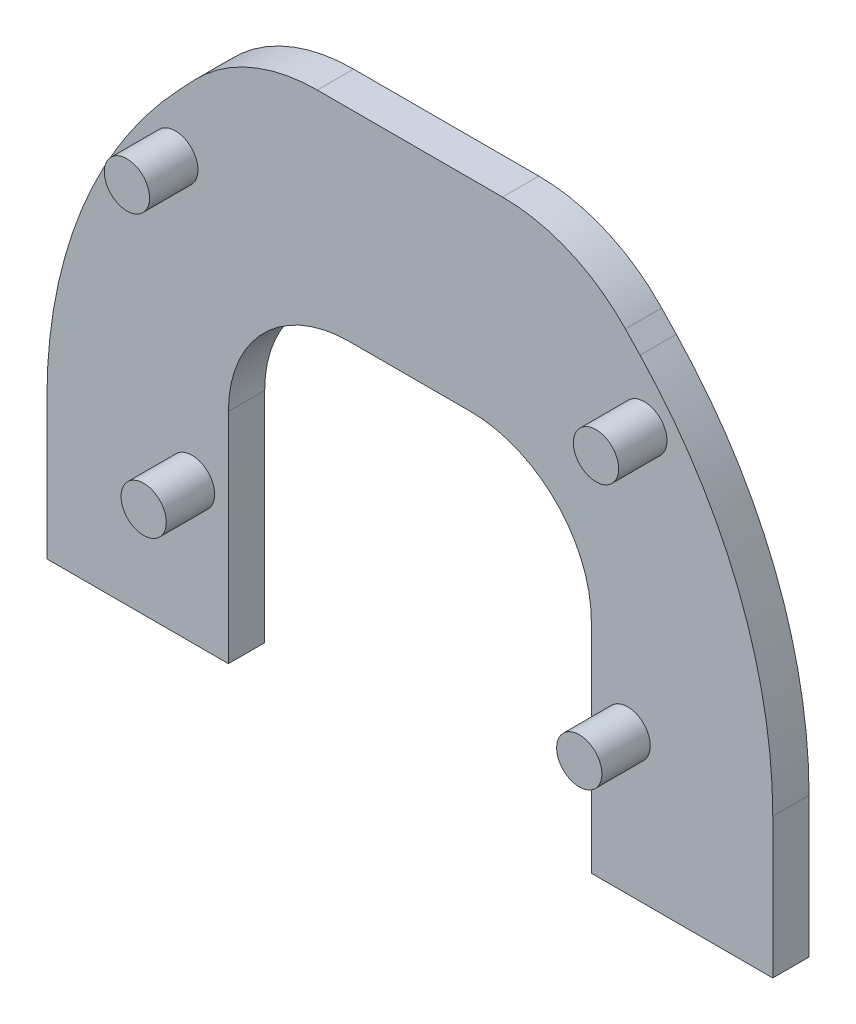
ISO-10303-21;
HEADER;
FILE_DESCRIPTION(('STEP AP214'),'2;1');
FILE_NAME('part.step','',(''),(''),'','','');
FILE_SCHEMA(('AUTOMOTIVE_DESIGN { 1 0 10303 214 1 1 1 1 }'));
ENDSEC;
DATA;
#1=APPLICATION_CONTEXT('core data for automotive mechanical design processes');
#2=APPLICATION_PROTOCOL_DEFINITION('international standard','automotive_design',2000,#1);
#3=PRODUCT_CONTEXT('',#1,'mechanical');
#4=PRODUCT('Part','Part','',(#3));
#5=PRODUCT_RELATED_PRODUCT_CATEGORY('part','',(#4));
#6=PRODUCT_DEFINITION_FORMATION('','',#4);
#7=PRODUCT_DEFINITION_CONTEXT('part definition',#1,'design');
#8=PRODUCT_DEFINITION('design','',#6,#7);
#9=PRODUCT_DEFINITION_SHAPE('','',#8);
#10=(LENGTH_UNIT() NAMED_UNIT(*) SI_UNIT(.MILLI.,.METRE.));
#11=(NAMED_UNIT(*) PLANE_ANGLE_UNIT() SI_UNIT($,.RADIAN.));
#12=(NAMED_UNIT(*) SI_UNIT($,.STERADIAN.) SOLID_ANGLE_UNIT());
#13=UNCERTAINTY_MEASURE_WITH_UNIT(LENGTH_MEASURE(1.E-05),#10,'distance_accuracy_value','');
#14=(GEOMETRIC_REPRESENTATION_CONTEXT(3) GLOBAL_UNCERTAINTY_ASSIGNED_CONTEXT((#13)) GLOBAL_UNIT_ASSIGNED_CONTEXT((#10,
#11,#12)) REPRESENTATION_CONTEXT('',''));
#15=CARTESIAN_POINT('',(0.,0.,0.));
#16=DIRECTION('',(0.,0.,1.));
#17=DIRECTION('',(1.,0.,0.));
#18=AXIS2_PLACEMENT_3D('',#15,#16,#17);
#19=CARTESIAN_POINT('',(-9.72558078659142,71.9793209120225,3.81));
#20=DIRECTION('',(0.,1.,0.));
#21=DIRECTION('',(0.,0.,1.));
#22=AXIS2_PLACEMENT_3D('',#19,#20,#21);
#23=PLANE('',#22);
#24=DIRECTION('',(1.,0.,0.));
#25=VECTOR('',#24,1.);
#26=CARTESIAN_POINT('',(-9.72558078659142,71.9793209120225,0.));
#27=LINE('',#26,#25);
#28=CARTESIAN_POINT('',(-9.72558078659142,71.9793209120225,0.));
#29=VERTEX_POINT('',#28);
#30=CARTESIAN_POINT('',(9.72558073248578,71.9793209120225,0.));
#31=VERTEX_POINT('',#30);
#32=EDGE_CURVE('E181',#29,#31,#27,.T.);
#33=ORIENTED_EDGE('',*,*,#32,.F.);
#34=DIRECTION('',(0.,0.,-1.));
#35=VECTOR('',#34,1.);
#36=CARTESIAN_POINT('',(-9.72558078659142,71.9793209120225,3.81));
#37=LINE('',#36,#35);
#38=CARTESIAN_POINT('',(-9.72558078659142,71.9793209120225,3.81));
#39=VERTEX_POINT('',#38);
#40=EDGE_CURVE('E51',#39,#29,#37,.T.);
#41=ORIENTED_EDGE('',*,*,#40,.F.);
#42=DIRECTION('',(1.,0.,0.));
#43=VECTOR('',#42,1.);
#44=CARTESIAN_POINT('',(-9.72558078659142,71.9793209120225,3.81));
#45=LINE('',#44,#43);
#46=CARTESIAN_POINT('',(9.72558073248578,71.9793209120225,3.81));
#47=VERTEX_POINT('',#46);
#48=EDGE_CURVE('E218',#39,#47,#45,.T.);
#49=ORIENTED_EDGE('',*,*,#48,.T.);
#50=DIRECTION('',(0.,0.,-1.));
#51=VECTOR('',#50,1.);
#52=CARTESIAN_POINT('',(9.72558073248578,71.9793209120225,3.81));
#53=LINE('',#52,#51);
#54=EDGE_CURVE('E36',#47,#31,#53,.T.);
#55=ORIENTED_EDGE('',*,*,#54,.T.);
#56=EDGE_LOOP('',(#33,#41,#49,#55));
#57=FACE_BOUND('',#56,.T.);
#58=ADVANCED_FACE('F33',(#57),#23,.T.);
#59=CARTESIAN_POINT('',(-9.72558078659142,54.1993209120225,3.81));
#60=DIRECTION('',(0.,0.,-1.));
#61=DIRECTION('',(-1.,0.,0.));
#62=AXIS2_PLACEMENT_3D('',#59,#60,#61);
#63=CYLINDRICAL_SURFACE('',#62,17.78);
#64=CARTESIAN_POINT('',(-9.72558078659142,54.1993209120225,0.));
#65=DIRECTION('',(0.,0.,1.));
#66=DIRECTION('',(1.,0.,0.));
#67=AXIS2_PLACEMENT_3D('',#64,#65,#66);
#68=CIRCLE('',#67,17.78);
#69=CARTESIAN_POINT('',(-22.6285472686429,66.4321397189475,0.));
#70=VERTEX_POINT('',#69);
#71=EDGE_CURVE('E104',#29,#70,#68,.T.);
#72=ORIENTED_EDGE('',*,*,#71,.T.);
#73=DIRECTION('',(0.,0.,-1.));
#74=VECTOR('',#73,1.);
#75=CARTESIAN_POINT('',(-22.6285472686429,66.4321397189475,3.81));
#76=LINE('',#75,#74);
#77=CARTESIAN_POINT('',(-22.6285472686429,66.4321397189475,3.81));
#78=VERTEX_POINT('',#77);
#79=EDGE_CURVE('E168',#78,#70,#76,.T.);
#80=ORIENTED_EDGE('',*,*,#79,.F.);
#81=CARTESIAN_POINT('',(-9.72558078659142,54.1993209120225,3.81));
#82=DIRECTION('',(0.,0.,1.));
#83=DIRECTION('',(1.,0.,0.));
#84=AXIS2_PLACEMENT_3D('',#81,#82,#83);
#85=CIRCLE('',#84,17.78);
#86=EDGE_CURVE('E158',#39,#78,#85,.T.);
#87=ORIENTED_EDGE('',*,*,#86,.F.);
#88=ORIENTED_EDGE('',*,*,#40,.T.);
#89=EDGE_LOOP('',(#72,#80,#87,#88));
#90=FACE_BOUND('',#89,.T.);
#91=ADVANCED_FACE('F326',(#90),#63,.T.);
#92=CARTESIAN_POINT('',(-22.6285472686429,66.4321397189475,3.81));
#93=DIRECTION('',(0.7257011519714,-0.688010056632447,0.));
#94=DIRECTION('',(0.688010056632447,0.7257011519714,0.));
#95=AXIS2_PLACEMENT_3D('',#92,#93,#94);
#96=PLANE('',#95);
#97=DIRECTION('',(-0.688010056632447,-0.7257011519714,0.));
#98=VECTOR('',#97,1.);
#99=CARTESIAN_POINT('',(-22.6285472686429,66.4321397189475,0.));
#100=LINE('',#99,#98);
#101=CARTESIAN_POINT('',(-24.165618520147,64.8108634496173,0.));
#102=VERTEX_POINT('',#101);
#103=EDGE_CURVE('E165',#70,#102,#100,.T.);
#104=ORIENTED_EDGE('',*,*,#103,.T.);
#105=DIRECTION('',(0.,0.,-1.));
#106=VECTOR('',#105,1.);
#107=CARTESIAN_POINT('',(-24.165618520147,64.8108634496173,3.81));
#108=LINE('',#107,#106);
#109=CARTESIAN_POINT('',(-24.165618520147,64.8108634496173,3.81));
#110=VERTEX_POINT('',#109);
#111=EDGE_CURVE('E162',#110,#102,#108,.T.);
#112=ORIENTED_EDGE('',*,*,#111,.F.);
#113=DIRECTION('',(-0.688010056632447,-0.7257011519714,0.));
#114=VECTOR('',#113,1.);
#115=CARTESIAN_POINT('',(-22.6285472686429,66.4321397189475,3.81));
#116=LINE('',#115,#114);
#117=EDGE_CURVE('E152',#78,#110,#116,.T.);
#118=ORIENTED_EDGE('',*,*,#117,.F.);
#119=ORIENTED_EDGE('',*,*,#79,.T.);
#120=EDGE_LOOP('',(#104,#112,#118,#119));
#121=FACE_BOUND('',#120,.T.);
#122=ADVANCED_FACE('F163',(#121),#96,.F.);
#123=CARTESIAN_POINT('',(12.7,29.8599525726889,3.81));
#124=DIRECTION('',(0.,0.,-1.));
#125=DIRECTION('',(-1.,0.,0.));
#126=AXIS2_PLACEMENT_3D('',#123,#124,#125);
#127=CYLINDRICAL_SURFACE('',#126,50.8);
#128=CARTESIAN_POINT('',(12.7,29.8599525726889,0.));
#129=DIRECTION('',(0.,0.,1.));
#130=DIRECTION('',(1.,0.,0.));
#131=AXIS2_PLACEMENT_3D('',#128,#129,#130);
#132=CIRCLE('',#131,50.8);
#133=CARTESIAN_POINT('',(-38.1,29.8599525726889,0.));
#134=VERTEX_POINT('',#133);
#135=EDGE_CURVE('E214',#102,#134,#132,.T.);
#136=ORIENTED_EDGE('',*,*,#135,.T.);
#137=DIRECTION('',(0.,0.,-1.));
#138=VECTOR('',#137,1.);
#139=CARTESIAN_POINT('',(-38.1,29.8599525726889,3.81));
#140=LINE('',#139,#138);
#141=CARTESIAN_POINT('',(-38.1,29.8599525726889,3.81));
#142=VERTEX_POINT('',#141);
#143=EDGE_CURVE('E169',#142,#134,#140,.T.);
#144=ORIENTED_EDGE('',*,*,#143,.F.);
#145=CARTESIAN_POINT('',(12.7,29.8599525726889,3.81));
#146=DIRECTION('',(0.,0.,1.));
#147=DIRECTION('',(1.,0.,0.));
#148=AXIS2_PLACEMENT_3D('',#145,#146,#147);
#149=CIRCLE('',#148,50.8);
#150=EDGE_CURVE('E156',#110,#142,#149,.T.);
#151=ORIENTED_EDGE('',*,*,#150,.F.);
#152=ORIENTED_EDGE('',*,*,#111,.T.);
#153=EDGE_LOOP('',(#136,#144,#151,#152));
#154=FACE_BOUND('',#153,.T.);
#155=ADVANCED_FACE('F171',(#154),#127,.T.);
#156=CARTESIAN_POINT('',(-38.1,29.8599525726889,3.81));
#157=DIRECTION('',(1.,0.,0.));
#158=DIRECTION('',(0.,0.,-1.));
#159=AXIS2_PLACEMENT_3D('',#156,#157,#158);
#160=PLANE('',#159);
#161=DIRECTION('',(0.,-1.,0.));
#162=VECTOR('',#161,1.);
#163=CARTESIAN_POINT('',(-38.1,29.8599525726889,0.));
#164=LINE('',#163,#162);
#165=CARTESIAN_POINT('',(-38.1,15.1587400793602,0.));
#166=VERTEX_POINT('',#165);
#167=EDGE_CURVE('E212',#134,#166,#164,.T.);
#168=ORIENTED_EDGE('',*,*,#167,.T.);
#169=DIRECTION('',(0.,0.,-1.));
#170=VECTOR('',#169,1.);
#171=CARTESIAN_POINT('',(-38.1,15.1587400793602,3.81));
#172=LINE('',#171,#170);
#173=CARTESIAN_POINT('',(-38.1,15.1587400793602,3.81));
#174=VERTEX_POINT('',#173);
#175=EDGE_CURVE('E222',#174,#166,#172,.T.);
#176=ORIENTED_EDGE('',*,*,#175,.F.);
#177=DIRECTION('',(0.,-1.,0.));
#178=VECTOR('',#177,1.);
#179=CARTESIAN_POINT('',(-38.1,29.8599525726889,3.81));
#180=LINE('',#179,#178);
#181=EDGE_CURVE('E174',#142,#174,#180,.T.);
#182=ORIENTED_EDGE('',*,*,#181,.F.);
#183=ORIENTED_EDGE('',*,*,#143,.T.);
#184=EDGE_LOOP('',(#168,#176,#182,#183));
#185=FACE_BOUND('',#184,.T.);
#186=ADVANCED_FACE('F259',(#185),#160,.F.);
#187=CARTESIAN_POINT('',(-38.1,15.1587400793602,3.81));
#188=DIRECTION('',(0.,1.,0.));
#189=DIRECTION('',(-1.,0.,0.));
#190=AXIS2_PLACEMENT_3D('',#187,#188,#189);
#191=PLANE('',#190);
#192=DIRECTION('',(1.,0.,0.));
#193=VECTOR('',#192,1.);
#194=CARTESIAN_POINT('',(-38.1,15.1587400793602,0.));
#195=LINE('',#194,#193);
#196=CARTESIAN_POINT('',(-19.05,15.1587400793602,0.));
#197=VERTEX_POINT('',#196);
#198=EDGE_CURVE('E210',#166,#197,#195,.T.);
#199=ORIENTED_EDGE('',*,*,#198,.T.);
#200=DIRECTION('',(0.,0.,-1.));
#201=VECTOR('',#200,1.);
#202=CARTESIAN_POINT('',(-19.05,15.1587400793602,3.81));
#203=LINE('',#202,#201);
#204=CARTESIAN_POINT('',(-19.05,15.1587400793602,3.81));
#205=VERTEX_POINT('',#204);
#206=EDGE_CURVE('E225',#205,#197,#203,.T.);
#207=ORIENTED_EDGE('',*,*,#206,.F.);
#208=DIRECTION('',(1.,0.,0.));
#209=VECTOR('',#208,1.);
#210=CARTESIAN_POINT('',(-38.1,15.1587400793602,3.81));
#211=LINE('',#210,#209);
#212=EDGE_CURVE('E176',#174,#205,#211,.T.);
#213=ORIENTED_EDGE('',*,*,#212,.F.);
#214=ORIENTED_EDGE('',*,*,#175,.T.);
#215=EDGE_LOOP('',(#199,#207,#213,#214));
#216=FACE_BOUND('',#215,.T.);
#217=ADVANCED_FACE('F268',(#216),#191,.F.);
#218=CARTESIAN_POINT('',(-19.05,15.1587400793602,3.81));
#219=DIRECTION('',(-1.,0.,0.));
#220=DIRECTION('',(0.,-1.,0.));
#221=AXIS2_PLACEMENT_3D('',#218,#219,#220);
#222=PLANE('',#221);
#223=DIRECTION('',(0.,1.,0.));
#224=VECTOR('',#223,1.);
#225=CARTESIAN_POINT('',(-19.05,15.1587400793602,0.));
#226=LINE('',#225,#224);
#227=CARTESIAN_POINT('',(-19.05,38.1,0.));
#228=VERTEX_POINT('',#227);
#229=EDGE_CURVE('E207',#197,#228,#226,.T.);
#230=ORIENTED_EDGE('',*,*,#229,.T.);
#231=DIRECTION('',(0.,0.,-1.));
#232=VECTOR('',#231,1.);
#233=CARTESIAN_POINT('',(-19.05,38.1,3.81));
#234=LINE('',#233,#232);
#235=CARTESIAN_POINT('',(-19.05,38.1,3.81));
#236=VERTEX_POINT('',#235);
#237=EDGE_CURVE('E228',#236,#228,#234,.T.);
#238=ORIENTED_EDGE('',*,*,#237,.F.);
#239=DIRECTION('',(0.,1.,0.));
#240=VECTOR('',#239,1.);
#241=CARTESIAN_POINT('',(-19.05,15.1587400793602,3.81));
#242=LINE('',#241,#240);
#243=EDGE_CURVE('E265',#205,#236,#242,.T.);
#244=ORIENTED_EDGE('',*,*,#243,.F.);
#245=ORIENTED_EDGE('',*,*,#206,.T.);
#246=EDGE_LOOP('',(#230,#238,#244,#245));
#247=FACE_BOUND('',#246,.T.);
#248=ADVANCED_FACE('F271',(#247),#222,.F.);
#249=CARTESIAN_POINT('',(-6.35,38.1,3.81));
#250=DIRECTION('',(0.,0.,-1.));
#251=DIRECTION('',(-1.,0.,0.));
#252=AXIS2_PLACEMENT_3D('',#249,#250,#251);
#253=CYLINDRICAL_SURFACE('',#252,12.7);
#254=CARTESIAN_POINT('',(-6.35,38.1,0.));
#255=DIRECTION('',(0.,0.,1.));
#256=DIRECTION('',(1.,0.,0.));
#257=AXIS2_PLACEMENT_3D('',#254,#255,#256);
#258=CIRCLE('',#257,12.7);
#259=CARTESIAN_POINT('',(-6.35,50.8,0.));
#260=VERTEX_POINT('',#259);
#261=EDGE_CURVE('E204',#260,#228,#258,.T.);
#262=ORIENTED_EDGE('',*,*,#261,.F.);
#263=DIRECTION('',(0.,0.,-1.));
#264=VECTOR('',#263,1.);
#265=CARTESIAN_POINT('',(-6.35,50.8,3.81));
#266=LINE('',#265,#264);
#267=CARTESIAN_POINT('',(-6.35,50.8,3.81));
#268=VERTEX_POINT('',#267);
#269=EDGE_CURVE('E230',#268,#260,#266,.T.);
#270=ORIENTED_EDGE('',*,*,#269,.F.);
#271=CARTESIAN_POINT('',(-6.35,38.1,3.81));
#272=DIRECTION('',(0.,0.,1.));
#273=DIRECTION('',(1.,0.,0.));
#274=AXIS2_PLACEMENT_3D('',#271,#272,#273);
#275=CIRCLE('',#274,12.7);
#276=EDGE_CURVE('E273',#268,#236,#275,.T.);
#277=ORIENTED_EDGE('',*,*,#276,.T.);
#278=ORIENTED_EDGE('',*,*,#237,.T.);
#279=EDGE_LOOP('',(#262,#270,#277,#278));
#280=FACE_BOUND('',#279,.T.);
#281=ADVANCED_FACE('F346',(#280),#253,.F.);
#282=CARTESIAN_POINT('',(-6.35,50.8,3.81));
#283=DIRECTION('',(0.,1.,0.));
#284=DIRECTION('',(0.,0.,1.));
#285=AXIS2_PLACEMENT_3D('',#282,#283,#284);
#286=PLANE('',#285);
#287=DIRECTION('',(1.,0.,0.));
#288=VECTOR('',#287,1.);
#289=CARTESIAN_POINT('',(-6.35,50.8,0.));
#290=LINE('',#289,#288);
#291=CARTESIAN_POINT('',(6.35000000000001,50.8,0.));
#292=VERTEX_POINT('',#291);
#293=EDGE_CURVE('E201',#260,#292,#290,.T.);
#294=ORIENTED_EDGE('',*,*,#293,.T.);
#295=DIRECTION('',(0.,0.,-1.));
#296=VECTOR('',#295,1.);
#297=CARTESIAN_POINT('',(6.35000000000001,50.8,3.81));
#298=LINE('',#297,#296);
#299=CARTESIAN_POINT('',(6.35000000000001,50.8,3.81));
#300=VERTEX_POINT('',#299);
#301=EDGE_CURVE('E232',#300,#292,#298,.T.);
#302=ORIENTED_EDGE('',*,*,#301,.F.);
#303=DIRECTION('',(1.,0.,0.));
#304=VECTOR('',#303,1.);
#305=CARTESIAN_POINT('',(-6.35,50.8,3.81));
#306=LINE('',#305,#304);
#307=EDGE_CURVE('E275',#268,#300,#306,.T.);
#308=ORIENTED_EDGE('',*,*,#307,.F.);
#309=ORIENTED_EDGE('',*,*,#269,.T.);
#310=EDGE_LOOP('',(#294,#302,#308,#309));
#311=FACE_BOUND('',#310,.T.);
#312=ADVANCED_FACE('F349',(#311),#286,.F.);
#313=CARTESIAN_POINT('',(6.35,38.1,3.81));
#314=DIRECTION('',(0.,0.,-1.));
#315=DIRECTION('',(-1.,0.,0.));
#316=AXIS2_PLACEMENT_3D('',#313,#314,#315);
#317=CYLINDRICAL_SURFACE('',#316,12.7);
#318=CARTESIAN_POINT('',(6.35,38.1,0.));
#319=DIRECTION('',(0.,0.,1.));
#320=DIRECTION('',(1.,0.,0.));
#321=AXIS2_PLACEMENT_3D('',#318,#319,#320);
#322=CIRCLE('',#321,12.7);
#323=CARTESIAN_POINT('',(19.05,38.1,0.));
#324=VERTEX_POINT('',#323);
#325=EDGE_CURVE('E198',#324,#292,#322,.T.);
#326=ORIENTED_EDGE('',*,*,#325,.F.);
#327=DIRECTION('',(0.,0.,-1.));
#328=VECTOR('',#327,1.);
#329=CARTESIAN_POINT('',(19.05,38.1,3.81));
#330=LINE('',#329,#328);
#331=CARTESIAN_POINT('',(19.05,38.1,3.81));
#332=VERTEX_POINT('',#331);
#333=EDGE_CURVE('E234',#332,#324,#330,.T.);
#334=ORIENTED_EDGE('',*,*,#333,.F.);
#335=CARTESIAN_POINT('',(6.35,38.1,3.81));
#336=DIRECTION('',(0.,0.,1.));
#337=DIRECTION('',(1.,0.,0.));
#338=AXIS2_PLACEMENT_3D('',#335,#336,#337);
#339=CIRCLE('',#338,12.7);
#340=EDGE_CURVE('E279',#332,#300,#339,.T.);
#341=ORIENTED_EDGE('',*,*,#340,.T.);
#342=ORIENTED_EDGE('',*,*,#301,.T.);
#343=EDGE_LOOP('',(#326,#334,#341,#342));
#344=FACE_BOUND('',#343,.T.);
#345=ADVANCED_FACE('F353',(#344),#317,.F.);
#346=CARTESIAN_POINT('',(19.05,38.1,3.81));
#347=DIRECTION('',(1.,0.,0.));
#348=DIRECTION('',(0.,1.,0.));
#349=AXIS2_PLACEMENT_3D('',#346,#347,#348);
#350=PLANE('',#349);
#351=DIRECTION('',(0.,-1.,0.));
#352=VECTOR('',#351,1.);
#353=CARTESIAN_POINT('',(19.05,38.1,0.));
#354=LINE('',#353,#352);
#355=CARTESIAN_POINT('',(19.05,15.1587400793602,0.));
#356=VERTEX_POINT('',#355);
#357=EDGE_CURVE('E196',#324,#356,#354,.T.);
#358=ORIENTED_EDGE('',*,*,#357,.T.);
#359=DIRECTION('',(0.,0.,-1.));
#360=VECTOR('',#359,1.);
#361=CARTESIAN_POINT('',(19.05,15.1587400793602,3.81));
#362=LINE('',#361,#360);
#363=CARTESIAN_POINT('',(19.05,15.1587400793602,3.81));
#364=VERTEX_POINT('',#363);
#365=EDGE_CURVE('E236',#364,#356,#362,.T.);
#366=ORIENTED_EDGE('',*,*,#365,.F.);
#367=DIRECTION('',(0.,-1.,0.));
#368=VECTOR('',#367,1.);
#369=CARTESIAN_POINT('',(19.05,38.1,3.81));
#370=LINE('',#369,#368);
#371=EDGE_CURVE('E282',#332,#364,#370,.T.);
#372=ORIENTED_EDGE('',*,*,#371,.F.);
#373=ORIENTED_EDGE('',*,*,#333,.T.);
#374=EDGE_LOOP('',(#358,#366,#372,#373));
#375=FACE_BOUND('',#374,.T.);
#376=ADVANCED_FACE('F357',(#375),#350,.F.);
#377=CARTESIAN_POINT('',(19.05,15.1587400793602,3.81));
#378=DIRECTION('',(0.,1.,0.));
#379=DIRECTION('',(-1.,0.,0.));
#380=AXIS2_PLACEMENT_3D('',#377,#378,#379);
#381=PLANE('',#380);
#382=DIRECTION('',(1.,0.,0.));
#383=VECTOR('',#382,1.);
#384=CARTESIAN_POINT('',(19.05,15.1587400793602,0.));
#385=LINE('',#384,#383);
#386=CARTESIAN_POINT('',(38.1,15.1587400793602,0.));
#387=VERTEX_POINT('',#386);
#388=EDGE_CURVE('E194',#356,#387,#385,.T.);
#389=ORIENTED_EDGE('',*,*,#388,.T.);
#390=DIRECTION('',(0.,0.,-1.));
#391=VECTOR('',#390,1.);
#392=CARTESIAN_POINT('',(38.1,15.1587400793602,3.81));
#393=LINE('',#392,#391);
#394=CARTESIAN_POINT('',(38.1,15.1587400793602,3.81));
#395=VERTEX_POINT('',#394);
#396=EDGE_CURVE('E239',#395,#387,#393,.T.);
#397=ORIENTED_EDGE('',*,*,#396,.F.);
#398=DIRECTION('',(1.,0.,0.));
#399=VECTOR('',#398,1.);
#400=CARTESIAN_POINT('',(19.05,15.1587400793602,3.81));
#401=LINE('',#400,#399);
#402=EDGE_CURVE('E284',#364,#395,#401,.T.);
#403=ORIENTED_EDGE('',*,*,#402,.F.);
#404=ORIENTED_EDGE('',*,*,#365,.T.);
#405=EDGE_LOOP('',(#389,#397,#403,#404));
#406=FACE_BOUND('',#405,.T.);
#407=ADVANCED_FACE('F361',(#406),#381,.F.);
#408=CARTESIAN_POINT('',(38.1,15.1587400793602,3.81));
#409=DIRECTION('',(-1.,0.,0.));
#410=DIRECTION('',(0.,0.,1.));
#411=AXIS2_PLACEMENT_3D('',#408,#409,#410);
#412=PLANE('',#411);
#413=DIRECTION('',(0.,1.,0.));
#414=VECTOR('',#413,1.);
#415=CARTESIAN_POINT('',(38.1,15.1587400793602,0.));
#416=LINE('',#415,#414);
#417=CARTESIAN_POINT('',(38.1,29.8599525214859,0.));
#418=VERTEX_POINT('',#417);
#419=EDGE_CURVE('E192',#387,#418,#416,.T.);
#420=ORIENTED_EDGE('',*,*,#419,.T.);
#421=DIRECTION('',(0.,0.,-1.));
#422=VECTOR('',#421,1.);
#423=CARTESIAN_POINT('',(38.1,29.8599525214859,3.81));
#424=LINE('',#423,#422);
#425=CARTESIAN_POINT('',(38.1,29.8599525214859,3.81));
#426=VERTEX_POINT('',#425);
#427=EDGE_CURVE('E242',#426,#418,#424,.T.);
#428=ORIENTED_EDGE('',*,*,#427,.F.);
#429=DIRECTION('',(0.,1.,0.));
#430=VECTOR('',#429,1.);
#431=CARTESIAN_POINT('',(38.1,15.1587400793602,3.81));
#432=LINE('',#431,#430);
#433=EDGE_CURVE('E286',#395,#426,#432,.T.);
#434=ORIENTED_EDGE('',*,*,#433,.F.);
#435=ORIENTED_EDGE('',*,*,#396,.T.);
#436=EDGE_LOOP('',(#420,#428,#434,#435));
#437=FACE_BOUND('',#436,.T.);
#438=ADVANCED_FACE('F365',(#437),#412,.F.);
#439=CARTESIAN_POINT('',(-12.7,29.8599525214859,3.81));
#440=DIRECTION('',(0.,0.,-1.));
#441=DIRECTION('',(-1.,0.,0.));
#442=AXIS2_PLACEMENT_3D('',#439,#440,#441);
#443=CYLINDRICAL_SURFACE('',#442,50.8);
#444=CARTESIAN_POINT('',(-12.7,29.8599525214859,0.));
#445=DIRECTION('',(0.,0.,1.));
#446=DIRECTION('',(1.,0.,0.));
#447=AXIS2_PLACEMENT_3D('',#444,#445,#446);
#448=CIRCLE('',#447,50.8);
#449=CARTESIAN_POINT('',(24.1656184570005,64.8108634650202,0.));
#450=VERTEX_POINT('',#449);
#451=EDGE_CURVE('E190',#418,#450,#448,.T.);
#452=ORIENTED_EDGE('',*,*,#451,.T.);
#453=DIRECTION('',(0.,0.,-1.));
#454=VECTOR('',#453,1.);
#455=CARTESIAN_POINT('',(24.1656184570005,64.8108634650202,3.81));
#456=LINE('',#455,#454);
#457=CARTESIAN_POINT('',(24.1656184570005,64.8108634650202,3.81));
#458=VERTEX_POINT('',#457);
#459=EDGE_CURVE('E245',#458,#450,#456,.T.);
#460=ORIENTED_EDGE('',*,*,#459,.F.);
#461=CARTESIAN_POINT('',(-12.7,29.8599525214859,3.81));
#462=DIRECTION('',(0.,0.,1.));
#463=DIRECTION('',(1.,0.,0.));
#464=AXIS2_PLACEMENT_3D('',#461,#462,#463);
#465=CIRCLE('',#464,50.8);
#466=EDGE_CURVE('E288',#426,#458,#465,.T.);
#467=ORIENTED_EDGE('',*,*,#466,.F.);
#468=ORIENTED_EDGE('',*,*,#427,.T.);
#469=EDGE_LOOP('',(#452,#460,#467,#468));
#470=FACE_BOUND('',#469,.T.);
#471=ADVANCED_FACE('F369',(#470),#443,.T.);
#472=CARTESIAN_POINT('',(24.1656184570005,64.8108634650202,3.81));
#473=DIRECTION('',(-0.725701150728358,-0.688010057943587,0.));
#474=DIRECTION('',(0.688010057943587,-0.725701150728358,0.));
#475=AXIS2_PLACEMENT_3D('',#472,#473,#474);
#476=PLANE('',#475);
#477=DIRECTION('',(-0.688010057943587,0.725701150728358,0.));
#478=VECTOR('',#477,1.);
#479=CARTESIAN_POINT('',(24.1656184570005,64.8108634650202,0.));
#480=LINE('',#479,#478);
#481=CARTESIAN_POINT('',(22.6285471924359,66.4321397422595,0.));
#482=VERTEX_POINT('',#481);
#483=EDGE_CURVE('E188',#450,#482,#480,.T.);
#484=ORIENTED_EDGE('',*,*,#483,.T.);
#485=DIRECTION('',(0.,0.,-1.));
#486=VECTOR('',#485,1.);
#487=CARTESIAN_POINT('',(22.6285471924359,66.4321397422595,3.81));
#488=LINE('',#487,#486);
#489=CARTESIAN_POINT('',(22.6285471924359,66.4321397422595,3.81));
#490=VERTEX_POINT('',#489);
#491=EDGE_CURVE('E247',#490,#482,#488,.T.);
#492=ORIENTED_EDGE('',*,*,#491,.F.);
#493=DIRECTION('',(-0.688010057943587,0.725701150728358,0.));
#494=VECTOR('',#493,1.);
#495=CARTESIAN_POINT('',(24.1656184570005,64.8108634650202,3.81));
#496=LINE('',#495,#494);
#497=EDGE_CURVE('E290',#458,#490,#496,.T.);
#498=ORIENTED_EDGE('',*,*,#497,.F.);
#499=ORIENTED_EDGE('',*,*,#459,.T.);
#500=EDGE_LOOP('',(#484,#492,#498,#499));
#501=FACE_BOUND('',#500,.T.);
#502=ADVANCED_FACE('F373',(#501),#476,.F.);
#503=CARTESIAN_POINT('',(9.72558073248578,54.1993209120225,3.81));
#504=DIRECTION('',(0.,0.,-1.));
#505=DIRECTION('',(-1.,0.,0.));
#506=AXIS2_PLACEMENT_3D('',#503,#504,#505);
#507=CYLINDRICAL_SURFACE('',#506,17.78);
#508=CARTESIAN_POINT('',(9.72558073248578,54.1993209120225,0.));
#509=DIRECTION('',(0.,0.,1.));
#510=DIRECTION('',(1.,0.,0.));
#511=AXIS2_PLACEMENT_3D('',#508,#509,#510);
#512=CIRCLE('',#511,17.78);
#513=EDGE_CURVE('E184',#482,#31,#512,.T.);
#514=ORIENTED_EDGE('',*,*,#513,.T.);
#515=ORIENTED_EDGE('',*,*,#54,.F.);
#516=CARTESIAN_POINT('',(9.72558073248578,54.1993209120225,3.81));
#517=DIRECTION('',(0.,0.,1.));
#518=DIRECTION('',(1.,0.,0.));
#519=AXIS2_PLACEMENT_3D('',#516,#517,#518);
#520=CIRCLE('',#519,17.78);
#521=EDGE_CURVE('E114',#490,#47,#520,.T.);
#522=ORIENTED_EDGE('',*,*,#521,.F.);
#523=ORIENTED_EDGE('',*,*,#491,.T.);
#524=EDGE_LOOP('',(#514,#515,#522,#523));
#525=FACE_BOUND('',#524,.T.);
#526=ADVANCED_FACE('F252',(#525),#507,.T.);
#527=CARTESIAN_POINT('',(9.72558073248578,54.1993209120225,3.81));
#528=DIRECTION('',(0.,0.,1.));
#529=DIRECTION('',(1.,0.,0.));
#530=AXIS2_PLACEMENT_3D('',#527,#528,#529);
#531=PLANE('',#530);
#532=CARTESIAN_POINT('',(22.8654210307654,29.826745674845,3.81));
#533=DIRECTION('',(0.,0.,1.));
#534=DIRECTION('',(1.,0.,0.));
#535=AXIS2_PLACEMENT_3D('',#532,#533,#534);
#536=CIRCLE('',#535,2.3749);
#537=CARTESIAN_POINT('',(25.2403210307654,29.826745674845,3.81));
#538=VERTEX_POINT('',#537);
#539=EDGE_CURVE('E11',#538,#538,#536,.T.);
#540=ORIENTED_EDGE('',*,*,#539,.F.);
#541=EDGE_LOOP('',(#540));
#542=FACE_BOUND('',#541,.T.);
#543=CARTESIAN_POINT('',(24.6225214451482,58.4452861325743,3.81));
#544=DIRECTION('',(0.,0.,1.));
#545=DIRECTION('',(1.,0.,0.));
#546=AXIS2_PLACEMENT_3D('',#543,#544,#545);
#547=CIRCLE('',#546,2.3749);
#548=CARTESIAN_POINT('',(26.9974214451482,58.4452861325743,3.81));
#549=VERTEX_POINT('',#548);
#550=EDGE_CURVE('E42',#549,#549,#547,.T.);
#551=ORIENTED_EDGE('',*,*,#550,.F.);
#552=EDGE_LOOP('',(#551));
#553=FACE_BOUND('',#552,.T.);
#554=CARTESIAN_POINT('',(-22.8654210307654,29.826745674845,3.81));
#555=DIRECTION('',(0.,0.,1.));
#556=DIRECTION('',(1.,0.,0.));
#557=AXIS2_PLACEMENT_3D('',#554,#555,#556);
#558=CIRCLE('',#557,2.3749);
#559=CARTESIAN_POINT('',(-20.4905210307654,29.826745674845,3.81));
#560=VERTEX_POINT('',#559);
#561=EDGE_CURVE('E299',#560,#560,#558,.F.);
#562=ORIENTED_EDGE('',*,*,#561,.T.);
#563=EDGE_LOOP('',(#562));
#564=FACE_BOUND('',#563,.T.);
#565=CARTESIAN_POINT('',(-24.6225214451482,58.4452861325743,3.81));
#566=DIRECTION('',(0.,0.,1.));
#567=DIRECTION('',(1.,0.,0.));
#568=AXIS2_PLACEMENT_3D('',#565,#566,#567);
#569=CIRCLE('',#568,2.3749);
#570=CARTESIAN_POINT('',(-22.2476214451482,58.4452861325743,3.81));
#571=VERTEX_POINT('',#570);
#572=EDGE_CURVE('E185',#571,#571,#569,.F.);
#573=ORIENTED_EDGE('',*,*,#572,.T.);
#574=EDGE_LOOP('',(#573));
#575=FACE_BOUND('',#574,.T.);
#576=ORIENTED_EDGE('',*,*,#48,.F.);
#577=ORIENTED_EDGE('',*,*,#86,.T.);
#578=ORIENTED_EDGE('',*,*,#117,.T.);
#579=ORIENTED_EDGE('',*,*,#150,.T.);
#580=ORIENTED_EDGE('',*,*,#181,.T.);
#581=ORIENTED_EDGE('',*,*,#212,.T.);
#582=ORIENTED_EDGE('',*,*,#243,.T.);
#583=ORIENTED_EDGE('',*,*,#276,.F.);
#584=ORIENTED_EDGE('',*,*,#307,.T.);
#585=ORIENTED_EDGE('',*,*,#340,.F.);
#586=ORIENTED_EDGE('',*,*,#371,.T.);
#587=ORIENTED_EDGE('',*,*,#402,.T.);
#588=ORIENTED_EDGE('',*,*,#433,.T.);
#589=ORIENTED_EDGE('',*,*,#466,.T.);
#590=ORIENTED_EDGE('',*,*,#497,.T.);
#591=ORIENTED_EDGE('',*,*,#521,.T.);
#592=EDGE_LOOP('',(#576,#577,#578,#579,#580,#581,#582,#583,#584,#585,#586,#587,#588,#589,#590,#591));
#593=FACE_BOUND('',#592,.T.);
#594=ADVANCED_FACE('F154',(#542,#553,#564,#575,#593),#531,.T.);
#595=CARTESIAN_POINT('',(9.72558073248578,54.1993209120225,0.));
#596=DIRECTION('',(0.,0.,1.));
#597=DIRECTION('',(1.,0.,0.));
#598=AXIS2_PLACEMENT_3D('',#595,#596,#597);
#599=PLANE('',#598);
#600=ORIENTED_EDGE('',*,*,#32,.T.);
#601=ORIENTED_EDGE('',*,*,#513,.F.);
#602=ORIENTED_EDGE('',*,*,#483,.F.);
#603=ORIENTED_EDGE('',*,*,#451,.F.);
#604=ORIENTED_EDGE('',*,*,#419,.F.);
#605=ORIENTED_EDGE('',*,*,#388,.F.);
#606=ORIENTED_EDGE('',*,*,#357,.F.);
#607=ORIENTED_EDGE('',*,*,#325,.T.);
#608=ORIENTED_EDGE('',*,*,#293,.F.);
#609=ORIENTED_EDGE('',*,*,#261,.T.);
#610=ORIENTED_EDGE('',*,*,#229,.F.);
#611=ORIENTED_EDGE('',*,*,#198,.F.);
#612=ORIENTED_EDGE('',*,*,#167,.F.);
#613=ORIENTED_EDGE('',*,*,#135,.F.);
#614=ORIENTED_EDGE('',*,*,#103,.F.);
#615=ORIENTED_EDGE('',*,*,#71,.F.);
#616=EDGE_LOOP('',(#600,#601,#602,#603,#604,#605,#606,#607,#608,#609,#610,#611,#612,#613,#614,#615));
#617=FACE_BOUND('',#616,.T.);
#618=ADVANCED_FACE('F255',(#617),#599,.F.);
#619=CARTESIAN_POINT('',(-24.6225214451482,58.4452861325743,8.89));
#620=DIRECTION('',(0.,0.,-1.));
#621=DIRECTION('',(-1.,0.,0.));
#622=AXIS2_PLACEMENT_3D('',#619,#620,#621);
#623=CYLINDRICAL_SURFACE('',#622,2.3749);
#624=ORIENTED_EDGE('',*,*,#572,.F.);
#625=EDGE_LOOP('',(#624));
#626=FACE_BOUND('',#625,.T.);
#627=CARTESIAN_POINT('',(-24.6225214451482,58.4452861325743,8.89));
#628=DIRECTION('',(0.,0.,1.));
#629=DIRECTION('',(1.,0.,0.));
#630=AXIS2_PLACEMENT_3D('',#627,#628,#629);
#631=CIRCLE('',#630,2.3749);
#632=CARTESIAN_POINT('',(-22.2476214451482,58.4452861325743,8.89));
#633=VERTEX_POINT('',#632);
#634=EDGE_CURVE('E296',#633,#633,#631,.T.);
#635=ORIENTED_EDGE('',*,*,#634,.F.);
#636=EDGE_LOOP('',(#635));
#637=FACE_BOUND('',#636,.T.);
#638=ADVANCED_FACE('F385',(#626,#637),#623,.T.);
#639=CARTESIAN_POINT('',(-24.6225214451482,58.4452861325743,8.89));
#640=DIRECTION('',(0.,0.,1.));
#641=DIRECTION('',(1.,0.,0.));
#642=AXIS2_PLACEMENT_3D('',#639,#640,#641);
#643=PLANE('',#642);
#644=ORIENTED_EDGE('',*,*,#634,.T.);
#645=EDGE_LOOP('',(#644));
#646=FACE_BOUND('',#645,.T.);
#647=ADVANCED_FACE('F391',(#646),#643,.T.);
#648=CARTESIAN_POINT('',(-22.8654210307654,29.826745674845,8.89));
#649=DIRECTION('',(0.,0.,-1.));
#650=DIRECTION('',(-1.,0.,0.));
#651=AXIS2_PLACEMENT_3D('',#648,#649,#650);
#652=CYLINDRICAL_SURFACE('',#651,2.3749);
#653=ORIENTED_EDGE('',*,*,#561,.F.);
#654=EDGE_LOOP('',(#653));
#655=FACE_BOUND('',#654,.T.);
#656=CARTESIAN_POINT('',(-22.8654210307654,29.826745674845,8.89));
#657=DIRECTION('',(0.,0.,1.));
#658=DIRECTION('',(1.,0.,0.));
#659=AXIS2_PLACEMENT_3D('',#656,#657,#658);
#660=CIRCLE('',#659,2.3749);
#661=CARTESIAN_POINT('',(-20.4905210307654,29.826745674845,8.89));
#662=VERTEX_POINT('',#661);
#663=EDGE_CURVE('E302',#662,#662,#660,.T.);
#664=ORIENTED_EDGE('',*,*,#663,.F.);
#665=EDGE_LOOP('',(#664));
#666=FACE_BOUND('',#665,.T.);
#667=ADVANCED_FACE('F395',(#655,#666),#652,.T.);
#668=CARTESIAN_POINT('',(-22.8654210307654,29.826745674845,8.89));
#669=DIRECTION('',(0.,0.,1.));
#670=DIRECTION('',(1.,0.,0.));
#671=AXIS2_PLACEMENT_3D('',#668,#669,#670);
#672=PLANE('',#671);
#673=ORIENTED_EDGE('',*,*,#663,.T.);
#674=EDGE_LOOP('',(#673));
#675=FACE_BOUND('',#674,.T.);
#676=ADVANCED_FACE('F397',(#675),#672,.T.);
#677=CARTESIAN_POINT('',(24.6225214451482,58.4452861325743,8.89));
#678=DIRECTION('',(0.,0.,-1.));
#679=DIRECTION('',(-1.,0.,0.));
#680=AXIS2_PLACEMENT_3D('',#677,#678,#679);
#681=CYLINDRICAL_SURFACE('',#680,2.3749);
#682=ORIENTED_EDGE('',*,*,#550,.T.);
#683=EDGE_LOOP('',(#682));
#684=FACE_BOUND('',#683,.T.);
#685=CARTESIAN_POINT('',(24.6225214451482,58.4452861325743,8.89));
#686=DIRECTION('',(0.,0.,-1.));
#687=DIRECTION('',(-1.,0.,0.));
#688=AXIS2_PLACEMENT_3D('',#685,#686,#687);
#689=CIRCLE('',#688,2.3749);
#690=CARTESIAN_POINT('',(22.2476214451482,58.4452861325743,8.89));
#691=VERTEX_POINT('',#690);
#692=EDGE_CURVE('E305',#691,#691,#689,.T.);
#693=ORIENTED_EDGE('',*,*,#692,.T.);
#694=EDGE_LOOP('',(#693));
#695=FACE_BOUND('',#694,.T.);
#696=ADVANCED_FACE('F400',(#684,#695),#681,.T.);
#697=CARTESIAN_POINT('',(24.6225214451482,58.4452861325743,8.89));
#698=DIRECTION('',(0.,0.,1.));
#699=DIRECTION('',(-1.,0.,0.));
#700=AXIS2_PLACEMENT_3D('',#697,#698,#699);
#701=PLANE('',#700);
#702=ORIENTED_EDGE('',*,*,#692,.F.);
#703=EDGE_LOOP('',(#702));
#704=FACE_BOUND('',#703,.T.);
#705=ADVANCED_FACE('F322',(#704),#701,.T.);
#706=CARTESIAN_POINT('',(22.8654210307654,29.826745674845,8.89));
#707=DIRECTION('',(0.,0.,-1.));
#708=DIRECTION('',(-1.,0.,0.));
#709=AXIS2_PLACEMENT_3D('',#706,#707,#708);
#710=CYLINDRICAL_SURFACE('',#709,2.3749);
#711=ORIENTED_EDGE('',*,*,#539,.T.);
#712=EDGE_LOOP('',(#711));
#713=FACE_BOUND('',#712,.T.);
#714=CARTESIAN_POINT('',(22.8654210307654,29.826745674845,8.89));
#715=DIRECTION('',(0.,0.,-1.));
#716=DIRECTION('',(-1.,0.,0.));
#717=AXIS2_PLACEMENT_3D('',#714,#715,#716);
#718=CIRCLE('',#717,2.3749);
#719=CARTESIAN_POINT('',(20.4905210307654,29.826745674845,8.89));
#720=VERTEX_POINT('',#719);
#721=EDGE_CURVE('E309',#720,#720,#718,.T.);
#722=ORIENTED_EDGE('',*,*,#721,.T.);
#723=EDGE_LOOP('',(#722));
#724=FACE_BOUND('',#723,.T.);
#725=ADVANCED_FACE('F314',(#713,#724),#710,.T.);
#726=CARTESIAN_POINT('',(22.8654210307654,29.826745674845,8.89));
#727=DIRECTION('',(0.,0.,1.));
#728=DIRECTION('',(-1.,0.,0.));
#729=AXIS2_PLACEMENT_3D('',#726,#727,#728);
#730=PLANE('',#729);
#731=ORIENTED_EDGE('',*,*,#721,.F.);
#732=EDGE_LOOP('',(#731));
#733=FACE_BOUND('',#732,.T.);
#734=ADVANCED_FACE('F316',(#733),#730,.T.);
#735=CLOSED_SHELL('',(#58,#91,#122,#155,#186,#217,#248,#281,#312,#345,#376,#407,#438,#471,#502,
#526,#594,#618,#638,#647,#667,#676,#696,#705,#725,#734));
#736=MANIFOLD_SOLID_BREP('B2',#735);
#737=ADVANCED_BREP_SHAPE_REPRESENTATION('',(#18,#736),#14);
#738=SHAPE_DEFINITION_REPRESENTATION(#9,#737);
ENDSEC;
END-ISO-10303-21;
